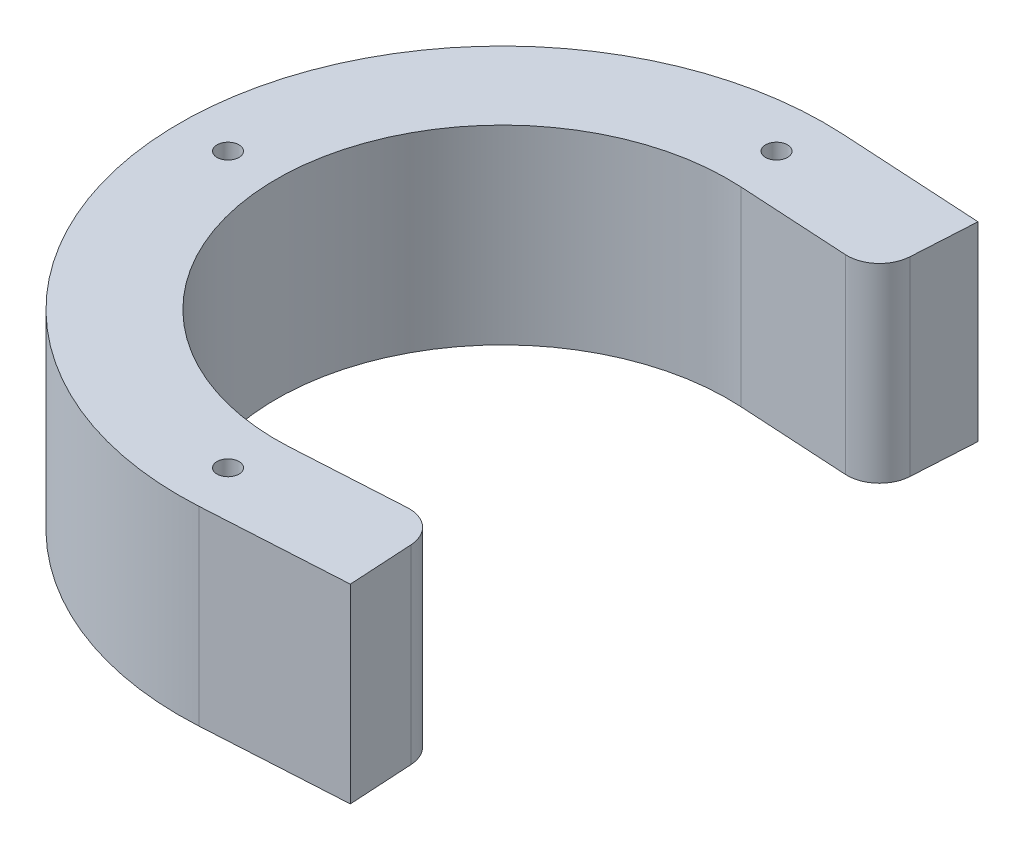
ISO-10303-21;
HEADER;
FILE_DESCRIPTION(('STEP AP214'),'2;1');
FILE_NAME('part.step','',(''),(''),'','','');
FILE_SCHEMA(('AUTOMOTIVE_DESIGN { 1 0 10303 214 1 1 1 1 }'));
ENDSEC;
DATA;
#1=APPLICATION_CONTEXT('core data for automotive mechanical design processes');
#2=APPLICATION_PROTOCOL_DEFINITION('international standard','automotive_design',2000,#1);
#3=PRODUCT_CONTEXT('',#1,'mechanical');
#4=PRODUCT('Part','Part','',(#3));
#5=PRODUCT_RELATED_PRODUCT_CATEGORY('part','',(#4));
#6=PRODUCT_DEFINITION_FORMATION('','',#4);
#7=PRODUCT_DEFINITION_CONTEXT('part definition',#1,'design');
#8=PRODUCT_DEFINITION('design','',#6,#7);
#9=PRODUCT_DEFINITION_SHAPE('','',#8);
#10=(LENGTH_UNIT() NAMED_UNIT(*) SI_UNIT(.MILLI.,.METRE.));
#11=(NAMED_UNIT(*) PLANE_ANGLE_UNIT() SI_UNIT($,.RADIAN.));
#12=(NAMED_UNIT(*) SI_UNIT($,.STERADIAN.) SOLID_ANGLE_UNIT());
#13=UNCERTAINTY_MEASURE_WITH_UNIT(LENGTH_MEASURE(1.E-05),#10,'distance_accuracy_value','');
#14=(GEOMETRIC_REPRESENTATION_CONTEXT(3) GLOBAL_UNCERTAINTY_ASSIGNED_CONTEXT((#13)) GLOBAL_UNIT_ASSIGNED_CONTEXT((#10,
#11,#12)) REPRESENTATION_CONTEXT('',''));
#15=CARTESIAN_POINT('',(0.,0.,0.));
#16=DIRECTION('',(0.,0.,1.));
#17=DIRECTION('',(1.,0.,0.));
#18=AXIS2_PLACEMENT_3D('',#15,#16,#17);
#19=CARTESIAN_POINT('',(0.,29.5,0.));
#20=DIRECTION('',(0.,1.,0.));
#21=DIRECTION('',(0.,0.,1.));
#22=AXIS2_PLACEMENT_3D('',#19,#20,#21);
#23=PLANE('',#22);
#24=CARTESIAN_POINT('',(0.,29.5,-42.5));
#25=DIRECTION('',(0.,1.,0.));
#26=DIRECTION('',(0.,0.,1.));
#27=AXIS2_PLACEMENT_3D('',#24,#25,#26);
#28=CIRCLE('',#27,1.7);
#29=CARTESIAN_POINT('',(0.,29.5,-40.8));
#30=VERTEX_POINT('',#29);
#31=EDGE_CURVE('E221',#30,#30,#28,.T.);
#32=ORIENTED_EDGE('',*,*,#31,.F.);
#33=EDGE_LOOP('',(#32));
#34=FACE_BOUND('',#33,.T.);
#35=DIRECTION('',(-0.0577382695995416,0.,-0.998331754590452));
#36=VECTOR('',#35,1.);
#37=CARTESIAN_POINT('',(24.220839435984,29.5,33.6576799127284));
#38=LINE('',#37,#36);
#39=CARTESIAN_POINT('',(25.0869134799771,29.5,48.6326562315852));
#40=VERTEX_POINT('',#39);
#41=CARTESIAN_POINT('',(24.5095307839817,29.5,38.6493386856806));
#42=VERTEX_POINT('',#41);
#43=EDGE_CURVE('E130',#40,#42,#38,.T.);
#44=ORIENTED_EDGE('',*,*,#43,.T.);
#45=CARTESIAN_POINT('',(19.5178720110294,29.5,38.9380300336784));
#46=DIRECTION('',(0.,1.,0.));
#47=DIRECTION('',(0.,0.,1.));
#48=AXIS2_PLACEMENT_3D('',#45,#46,#47);
#49=CIRCLE('',#48,5.);
#50=CARTESIAN_POINT('',(19.2291806630317,29.5,33.9463712607261));
#51=VERTEX_POINT('',#50);
#52=EDGE_CURVE('E160',#42,#51,#49,.T.);
#53=ORIENTED_EDGE('',*,*,#52,.T.);
#54=DIRECTION('',(-0.998331754590452,0.,0.0577382695995421));
#55=VECTOR('',#54,1.);
#56=CARTESIAN_POINT('',(2.02083943598396,29.5,34.9416114106658));
#57=LINE('',#56,#55);
#58=CARTESIAN_POINT('',(2.02083943598397,29.5,34.9416114106658));
#59=VERTEX_POINT('',#58);
#60=EDGE_CURVE('E215',#51,#59,#57,.T.);
#61=ORIENTED_EDGE('',*,*,#60,.T.);
#62=CARTESIAN_POINT('',(0.,29.5,0.));
#63=DIRECTION('',(0.,-1.,0.));
#64=DIRECTION('',(0.,0.,1.));
#65=AXIS2_PLACEMENT_3D('',#62,#63,#64);
#66=CIRCLE('',#65,35.);
#67=CARTESIAN_POINT('',(2.02083943598396,29.5,-34.9416114106658));
#68=VERTEX_POINT('',#67);
#69=EDGE_CURVE('E197',#59,#68,#66,.T.);
#70=ORIENTED_EDGE('',*,*,#69,.T.);
#71=DIRECTION('',(0.998331754590452,0.,0.0577382695995421));
#72=VECTOR('',#71,1.);
#73=CARTESIAN_POINT('',(2.02083943598396,29.5,-34.9416114106658));
#74=LINE('',#73,#72);
#75=CARTESIAN_POINT('',(19.2291806630317,29.5,-33.9463712607261));
#76=VERTEX_POINT('',#75);
#77=EDGE_CURVE('E212',#68,#76,#74,.T.);
#78=ORIENTED_EDGE('',*,*,#77,.T.);
#79=CARTESIAN_POINT('',(19.5178720110294,29.5,-38.9380300336784));
#80=DIRECTION('',(0.,1.,0.));
#81=DIRECTION('',(0.,0.,1.));
#82=AXIS2_PLACEMENT_3D('',#79,#80,#81);
#83=CIRCLE('',#82,5.);
#84=CARTESIAN_POINT('',(24.5095307839817,29.5,-38.6493386856806));
#85=VERTEX_POINT('',#84);
#86=EDGE_CURVE('E58',#76,#85,#83,.T.);
#87=ORIENTED_EDGE('',*,*,#86,.T.);
#88=DIRECTION('',(0.0577382695995416,0.,-0.998331754590452));
#89=VECTOR('',#88,1.);
#90=CARTESIAN_POINT('',(24.220839435984,29.5,-33.6576799127284));
#91=LINE('',#90,#89);
#92=CARTESIAN_POINT('',(25.0869134799771,29.5,-48.6326562315852));
#93=VERTEX_POINT('',#92);
#94=EDGE_CURVE('E169',#85,#93,#91,.T.);
#95=ORIENTED_EDGE('',*,*,#94,.T.);
#96=DIRECTION('',(-0.998331754590452,0.,-0.0577382695995424));
#97=VECTOR('',#96,1.);
#98=CARTESIAN_POINT('',(2.88691347997709,29.5,-49.9165877295226));
#99=LINE('',#98,#97);
#100=CARTESIAN_POINT('',(2.88691347997709,29.5,-49.9165877295226));
#101=VERTEX_POINT('',#100);
#102=EDGE_CURVE('E136',#93,#101,#99,.T.);
#103=ORIENTED_EDGE('',*,*,#102,.T.);
#104=CARTESIAN_POINT('',(0.,29.5,0.));
#105=DIRECTION('',(0.,1.,0.));
#106=DIRECTION('',(0.,0.,1.));
#107=AXIS2_PLACEMENT_3D('',#104,#105,#106);
#108=CIRCLE('',#107,50.);
#109=CARTESIAN_POINT('',(2.88691347997709,29.5,49.9165877295226));
#110=VERTEX_POINT('',#109);
#111=EDGE_CURVE('E131',#101,#110,#108,.T.);
#112=ORIENTED_EDGE('',*,*,#111,.T.);
#113=DIRECTION('',(0.998331754590452,0.,-0.0577382695995424));
#114=VECTOR('',#113,1.);
#115=CARTESIAN_POINT('',(2.88691347997709,29.5,49.9165877295226));
#116=LINE('',#115,#114);
#117=EDGE_CURVE('E120',#110,#40,#116,.T.);
#118=ORIENTED_EDGE('',*,*,#117,.T.);
#119=EDGE_LOOP('',(#44,#53,#61,#70,#78,#87,#95,#103,#112,#118));
#120=FACE_BOUND('',#119,.T.);
#121=CARTESIAN_POINT('',(-42.5,29.5,0.));
#122=DIRECTION('',(0.,1.,0.));
#123=DIRECTION('',(0.,0.,1.));
#124=AXIS2_PLACEMENT_3D('',#121,#122,#123);
#125=CIRCLE('',#124,1.7);
#126=CARTESIAN_POINT('',(-42.5,29.5,1.7));
#127=VERTEX_POINT('',#126);
#128=EDGE_CURVE('E209',#127,#127,#125,.T.);
#129=ORIENTED_EDGE('',*,*,#128,.F.);
#130=EDGE_LOOP('',(#129));
#131=FACE_BOUND('',#130,.T.);
#132=CARTESIAN_POINT('',(0.,29.5,42.5));
#133=DIRECTION('',(0.,1.,0.));
#134=DIRECTION('',(0.,0.,-1.));
#135=AXIS2_PLACEMENT_3D('',#132,#133,#134);
#136=CIRCLE('',#135,1.7);
#137=CARTESIAN_POINT('',(0.,29.5,40.8));
#138=VERTEX_POINT('',#137);
#139=EDGE_CURVE('E227',#138,#138,#136,.T.);
#140=ORIENTED_EDGE('',*,*,#139,.F.);
#141=EDGE_LOOP('',(#140));
#142=FACE_BOUND('',#141,.T.);
#143=ADVANCED_FACE('F43',(#34,#120,#131,#142),#23,.T.);
#144=CARTESIAN_POINT('',(0.,0.,0.));
#145=DIRECTION('',(0.,1.,0.));
#146=DIRECTION('',(0.,0.,1.));
#147=AXIS2_PLACEMENT_3D('',#144,#145,#146);
#148=PLANE('',#147);
#149=DIRECTION('',(-0.998331754590452,0.,0.0577382695995421));
#150=VECTOR('',#149,1.);
#151=CARTESIAN_POINT('',(2.02083943598396,0.,34.9416114106658));
#152=LINE('',#151,#150);
#153=CARTESIAN_POINT('',(19.2291806630317,0.,33.9463712607261));
#154=VERTEX_POINT('',#153);
#155=CARTESIAN_POINT('',(2.02083943598397,0.,34.9416114106658));
#156=VERTEX_POINT('',#155);
#157=EDGE_CURVE('E200',#154,#156,#152,.T.);
#158=ORIENTED_EDGE('',*,*,#157,.F.);
#159=CARTESIAN_POINT('',(19.5178720110294,0.,38.9380300336784));
#160=DIRECTION('',(0.,1.,0.));
#161=DIRECTION('',(0.,0.,1.));
#162=AXIS2_PLACEMENT_3D('',#159,#160,#161);
#163=CIRCLE('',#162,5.);
#164=CARTESIAN_POINT('',(24.5095307839817,0.,38.6493386856806));
#165=VERTEX_POINT('',#164);
#166=EDGE_CURVE('E155',#154,#165,#163,.F.);
#167=ORIENTED_EDGE('',*,*,#166,.T.);
#168=DIRECTION('',(-0.0577382695995416,0.,-0.998331754590452));
#169=VECTOR('',#168,1.);
#170=CARTESIAN_POINT('',(24.220839435984,0.,33.6576799127284));
#171=LINE('',#170,#169);
#172=CARTESIAN_POINT('',(25.0869134799771,0.,48.6326562315852));
#173=VERTEX_POINT('',#172);
#174=EDGE_CURVE('E201',#173,#165,#171,.T.);
#175=ORIENTED_EDGE('',*,*,#174,.F.);
#176=DIRECTION('',(0.998331754590452,0.,-0.0577382695995424));
#177=VECTOR('',#176,1.);
#178=CARTESIAN_POINT('',(2.88691347997709,0.,49.9165877295226));
#179=LINE('',#178,#177);
#180=CARTESIAN_POINT('',(2.88691347997709,0.,49.9165877295226));
#181=VERTEX_POINT('',#180);
#182=EDGE_CURVE('E206',#181,#173,#179,.T.);
#183=ORIENTED_EDGE('',*,*,#182,.F.);
#184=CARTESIAN_POINT('',(0.,0.,0.));
#185=DIRECTION('',(0.,1.,0.));
#186=DIRECTION('',(0.,0.,1.));
#187=AXIS2_PLACEMENT_3D('',#184,#185,#186);
#188=CIRCLE('',#187,50.);
#189=CARTESIAN_POINT('',(2.88691347997709,0.,-49.9165877295226));
#190=VERTEX_POINT('',#189);
#191=EDGE_CURVE('E144',#190,#181,#188,.T.);
#192=ORIENTED_EDGE('',*,*,#191,.F.);
#193=DIRECTION('',(-0.998331754590452,0.,-0.0577382695995424));
#194=VECTOR('',#193,1.);
#195=CARTESIAN_POINT('',(2.88691347997709,0.,-49.9165877295226));
#196=LINE('',#195,#194);
#197=CARTESIAN_POINT('',(25.0869134799771,0.,-48.6326562315852));
#198=VERTEX_POINT('',#197);
#199=EDGE_CURVE('E140',#198,#190,#196,.T.);
#200=ORIENTED_EDGE('',*,*,#199,.F.);
#201=DIRECTION('',(0.0577382695995416,0.,-0.998331754590452));
#202=VECTOR('',#201,1.);
#203=CARTESIAN_POINT('',(24.220839435984,0.,-33.6576799127284));
#204=LINE('',#203,#202);
#205=CARTESIAN_POINT('',(24.5095307839817,0.,-38.6493386856806));
#206=VERTEX_POINT('',#205);
#207=EDGE_CURVE('E167',#206,#198,#204,.T.);
#208=ORIENTED_EDGE('',*,*,#207,.F.);
#209=CARTESIAN_POINT('',(19.5178720110294,0.,-38.9380300336784));
#210=DIRECTION('',(0.,1.,0.));
#211=DIRECTION('',(0.,0.,1.));
#212=AXIS2_PLACEMENT_3D('',#209,#210,#211);
#213=CIRCLE('',#212,5.);
#214=CARTESIAN_POINT('',(19.2291806630317,0.,-33.9463712607261));
#215=VERTEX_POINT('',#214);
#216=EDGE_CURVE('E148',#206,#215,#213,.F.);
#217=ORIENTED_EDGE('',*,*,#216,.T.);
#218=DIRECTION('',(0.998331754590452,0.,0.0577382695995421));
#219=VECTOR('',#218,1.);
#220=CARTESIAN_POINT('',(2.02083943598396,0.,-34.9416114106658));
#221=LINE('',#220,#219);
#222=CARTESIAN_POINT('',(2.02083943598396,0.,-34.9416114106658));
#223=VERTEX_POINT('',#222);
#224=EDGE_CURVE('E177',#223,#215,#221,.T.);
#225=ORIENTED_EDGE('',*,*,#224,.F.);
#226=CARTESIAN_POINT('',(0.,0.,0.));
#227=DIRECTION('',(0.,-1.,0.));
#228=DIRECTION('',(0.,0.,1.));
#229=AXIS2_PLACEMENT_3D('',#226,#227,#228);
#230=CIRCLE('',#229,35.);
#231=EDGE_CURVE('E180',#156,#223,#230,.T.);
#232=ORIENTED_EDGE('',*,*,#231,.F.);
#233=EDGE_LOOP('',(#158,#167,#175,#183,#192,#200,#208,#217,#225,#232));
#234=FACE_BOUND('',#233,.T.);
#235=CARTESIAN_POINT('',(-42.5,0.,0.));
#236=DIRECTION('',(0.,1.,0.));
#237=DIRECTION('',(0.,0.,1.));
#238=AXIS2_PLACEMENT_3D('',#235,#236,#237);
#239=CIRCLE('',#238,1.7);
#240=CARTESIAN_POINT('',(-42.5,0.,1.7));
#241=VERTEX_POINT('',#240);
#242=EDGE_CURVE('E218',#241,#241,#239,.T.);
#243=ORIENTED_EDGE('',*,*,#242,.T.);
#244=EDGE_LOOP('',(#243));
#245=FACE_BOUND('',#244,.T.);
#246=CARTESIAN_POINT('',(0.,0.,-42.5));
#247=DIRECTION('',(0.,1.,0.));
#248=DIRECTION('',(0.,0.,1.));
#249=AXIS2_PLACEMENT_3D('',#246,#247,#248);
#250=CIRCLE('',#249,1.7);
#251=CARTESIAN_POINT('',(0.,0.,-40.8));
#252=VERTEX_POINT('',#251);
#253=EDGE_CURVE('E224',#252,#252,#250,.T.);
#254=ORIENTED_EDGE('',*,*,#253,.T.);
#255=EDGE_LOOP('',(#254));
#256=FACE_BOUND('',#255,.T.);
#257=CARTESIAN_POINT('',(0.,0.,42.5));
#258=DIRECTION('',(0.,1.,0.));
#259=DIRECTION('',(0.,0.,-1.));
#260=AXIS2_PLACEMENT_3D('',#257,#258,#259);
#261=CIRCLE('',#260,1.7);
#262=CARTESIAN_POINT('',(0.,0.,40.8));
#263=VERTEX_POINT('',#262);
#264=EDGE_CURVE('E230',#263,#263,#261,.T.);
#265=ORIENTED_EDGE('',*,*,#264,.T.);
#266=EDGE_LOOP('',(#265));
#267=FACE_BOUND('',#266,.T.);
#268=ADVANCED_FACE('F174',(#234,#245,#256,#267),#148,.F.);
#269=CARTESIAN_POINT('',(0.,29.5,0.));
#270=DIRECTION('',(0.,-1.,0.));
#271=DIRECTION('',(0.,0.,-1.));
#272=AXIS2_PLACEMENT_3D('',#269,#270,#271);
#273=CYLINDRICAL_SURFACE('',#272,50.);
#274=ORIENTED_EDGE('',*,*,#191,.T.);
#275=DIRECTION('',(0.,-1.,0.));
#276=VECTOR('',#275,1.);
#277=CARTESIAN_POINT('',(2.88691347997709,29.5,49.9165877295226));
#278=LINE('',#277,#276);
#279=EDGE_CURVE('E124',#110,#181,#278,.T.);
#280=ORIENTED_EDGE('',*,*,#279,.F.);
#281=ORIENTED_EDGE('',*,*,#111,.F.);
#282=DIRECTION('',(0.,-1.,0.));
#283=VECTOR('',#282,1.);
#284=CARTESIAN_POINT('',(2.88691347997709,29.5,-49.9165877295226));
#285=LINE('',#284,#283);
#286=EDGE_CURVE('E184',#101,#190,#285,.T.);
#287=ORIENTED_EDGE('',*,*,#286,.T.);
#288=EDGE_LOOP('',(#274,#280,#281,#287));
#289=FACE_BOUND('',#288,.T.);
#290=ADVANCED_FACE('F142',(#289),#273,.T.);
#291=CARTESIAN_POINT('',(2.88691347997709,29.5,49.9165877295226));
#292=DIRECTION('',(-0.0577382695995424,0.,-0.998331754590452));
#293=DIRECTION('',(-0.998331754590452,0.,0.0577382695995424));
#294=AXIS2_PLACEMENT_3D('',#291,#292,#293);
#295=PLANE('',#294);
#296=ORIENTED_EDGE('',*,*,#182,.T.);
#297=DIRECTION('',(0.,-1.,0.));
#298=VECTOR('',#297,1.);
#299=CARTESIAN_POINT('',(25.0869134799771,29.5,48.6326562315852));
#300=LINE('',#299,#298);
#301=EDGE_CURVE('E127',#40,#173,#300,.T.);
#302=ORIENTED_EDGE('',*,*,#301,.F.);
#303=ORIENTED_EDGE('',*,*,#117,.F.);
#304=ORIENTED_EDGE('',*,*,#279,.T.);
#305=EDGE_LOOP('',(#296,#302,#303,#304));
#306=FACE_BOUND('',#305,.T.);
#307=ADVANCED_FACE('F122',(#306),#295,.F.);
#308=CARTESIAN_POINT('',(24.220839435984,29.5,33.6576799127284));
#309=DIRECTION('',(-0.998331754590452,0.,0.0577382695995416));
#310=DIRECTION('',(0.0577382695995416,0.,0.998331754590452));
#311=AXIS2_PLACEMENT_3D('',#308,#309,#310);
#312=PLANE('',#311);
#313=ORIENTED_EDGE('',*,*,#174,.T.);
#314=DIRECTION('',(0.,-1.,0.));
#315=VECTOR('',#314,1.);
#316=CARTESIAN_POINT('',(24.5095307839817,29.5,38.6493386856806));
#317=LINE('',#316,#315);
#318=EDGE_CURVE('E157',#165,#42,#317,.F.);
#319=ORIENTED_EDGE('',*,*,#318,.T.);
#320=ORIENTED_EDGE('',*,*,#43,.F.);
#321=ORIENTED_EDGE('',*,*,#301,.T.);
#322=EDGE_LOOP('',(#313,#319,#320,#321));
#323=FACE_BOUND('',#322,.T.);
#324=ADVANCED_FACE('F266',(#323),#312,.F.);
#325=CARTESIAN_POINT('',(2.02083943598396,29.5,34.9416114106658));
#326=DIRECTION('',(0.0577382695995421,0.,0.998331754590452));
#327=DIRECTION('',(0.998331754590452,0.,-0.0577382695995421));
#328=AXIS2_PLACEMENT_3D('',#325,#326,#327);
#329=PLANE('',#328);
#330=ORIENTED_EDGE('',*,*,#60,.F.);
#331=DIRECTION('',(0.,-1.,0.));
#332=VECTOR('',#331,1.);
#333=CARTESIAN_POINT('',(19.2291806630317,29.5,33.9463712607261));
#334=LINE('',#333,#332);
#335=EDGE_CURVE('E145',#51,#154,#334,.T.);
#336=ORIENTED_EDGE('',*,*,#335,.T.);
#337=ORIENTED_EDGE('',*,*,#157,.T.);
#338=DIRECTION('',(0.,-1.,0.));
#339=VECTOR('',#338,1.);
#340=CARTESIAN_POINT('',(2.02083943598397,29.5,34.9416114106658));
#341=LINE('',#340,#339);
#342=EDGE_CURVE('E150',#59,#156,#341,.T.);
#343=ORIENTED_EDGE('',*,*,#342,.F.);
#344=EDGE_LOOP('',(#330,#336,#337,#343));
#345=FACE_BOUND('',#344,.T.);
#346=ADVANCED_FACE('F263',(#345),#329,.F.);
#347=CARTESIAN_POINT('',(0.,29.5,0.));
#348=DIRECTION('',(0.,-1.,0.));
#349=DIRECTION('',(0.,0.,-1.));
#350=AXIS2_PLACEMENT_3D('',#347,#348,#349);
#351=CYLINDRICAL_SURFACE('',#350,35.);
#352=ORIENTED_EDGE('',*,*,#231,.T.);
#353=DIRECTION('',(0.,-1.,0.));
#354=VECTOR('',#353,1.);
#355=CARTESIAN_POINT('',(2.02083943598396,29.5,-34.9416114106658));
#356=LINE('',#355,#354);
#357=EDGE_CURVE('E188',#68,#223,#356,.T.);
#358=ORIENTED_EDGE('',*,*,#357,.F.);
#359=ORIENTED_EDGE('',*,*,#69,.F.);
#360=ORIENTED_EDGE('',*,*,#342,.T.);
#361=EDGE_LOOP('',(#352,#358,#359,#360));
#362=FACE_BOUND('',#361,.T.);
#363=ADVANCED_FACE('F195',(#362),#351,.F.);
#364=CARTESIAN_POINT('',(2.02083943598396,29.5,-34.9416114106658));
#365=DIRECTION('',(0.0577382695995421,0.,-0.998331754590452));
#366=DIRECTION('',(-0.998331754590452,0.,-0.0577382695995421));
#367=AXIS2_PLACEMENT_3D('',#364,#365,#366);
#368=PLANE('',#367);
#369=ORIENTED_EDGE('',*,*,#224,.T.);
#370=DIRECTION('',(0.,-1.,0.));
#371=VECTOR('',#370,1.);
#372=CARTESIAN_POINT('',(19.2291806630317,29.5,-33.9463712607261));
#373=LINE('',#372,#371);
#374=EDGE_CURVE('E11',#215,#76,#373,.F.);
#375=ORIENTED_EDGE('',*,*,#374,.T.);
#376=ORIENTED_EDGE('',*,*,#77,.F.);
#377=ORIENTED_EDGE('',*,*,#357,.T.);
#378=EDGE_LOOP('',(#369,#375,#376,#377));
#379=FACE_BOUND('',#378,.T.);
#380=ADVANCED_FACE('F258',(#379),#368,.F.);
#381=CARTESIAN_POINT('',(24.220839435984,29.5,-33.6576799127284));
#382=DIRECTION('',(-0.998331754590452,0.,-0.0577382695995416));
#383=DIRECTION('',(-0.0577382695995416,0.,0.998331754590452));
#384=AXIS2_PLACEMENT_3D('',#381,#382,#383);
#385=PLANE('',#384);
#386=ORIENTED_EDGE('',*,*,#94,.F.);
#387=DIRECTION('',(0.,-1.,0.));
#388=VECTOR('',#387,1.);
#389=CARTESIAN_POINT('',(24.5095307839817,29.5,-38.6493386856806));
#390=LINE('',#389,#388);
#391=EDGE_CURVE('E51',#85,#206,#390,.T.);
#392=ORIENTED_EDGE('',*,*,#391,.T.);
#393=ORIENTED_EDGE('',*,*,#207,.T.);
#394=DIRECTION('',(0.,-1.,0.));
#395=VECTOR('',#394,1.);
#396=CARTESIAN_POINT('',(25.0869134799771,29.5,-48.6326562315852));
#397=LINE('',#396,#395);
#398=EDGE_CURVE('E186',#93,#198,#397,.T.);
#399=ORIENTED_EDGE('',*,*,#398,.F.);
#400=EDGE_LOOP('',(#386,#392,#393,#399));
#401=FACE_BOUND('',#400,.T.);
#402=ADVANCED_FACE('F165',(#401),#385,.F.);
#403=CARTESIAN_POINT('',(2.88691347997709,29.5,-49.9165877295226));
#404=DIRECTION('',(-0.0577382695995424,0.,0.998331754590452));
#405=DIRECTION('',(0.998331754590452,0.,0.0577382695995424));
#406=AXIS2_PLACEMENT_3D('',#403,#404,#405);
#407=PLANE('',#406);
#408=ORIENTED_EDGE('',*,*,#199,.T.);
#409=ORIENTED_EDGE('',*,*,#286,.F.);
#410=ORIENTED_EDGE('',*,*,#102,.F.);
#411=ORIENTED_EDGE('',*,*,#398,.T.);
#412=EDGE_LOOP('',(#408,#409,#410,#411));
#413=FACE_BOUND('',#412,.T.);
#414=ADVANCED_FACE('F252',(#413),#407,.F.);
#415=CARTESIAN_POINT('',(-42.5,29.5,0.));
#416=DIRECTION('',(0.,-1.,0.));
#417=DIRECTION('',(0.,0.,-1.));
#418=AXIS2_PLACEMENT_3D('',#415,#416,#417);
#419=CYLINDRICAL_SURFACE('',#418,1.7);
#420=ORIENTED_EDGE('',*,*,#128,.T.);
#421=EDGE_LOOP('',(#420));
#422=FACE_BOUND('',#421,.T.);
#423=ORIENTED_EDGE('',*,*,#242,.F.);
#424=EDGE_LOOP('',(#423));
#425=FACE_BOUND('',#424,.T.);
#426=ADVANCED_FACE('F249',(#422,#425),#419,.F.);
#427=CARTESIAN_POINT('',(0.,29.5,-42.5));
#428=DIRECTION('',(0.,-1.,0.));
#429=DIRECTION('',(0.,0.,-1.));
#430=AXIS2_PLACEMENT_3D('',#427,#428,#429);
#431=CYLINDRICAL_SURFACE('',#430,1.7);
#432=ORIENTED_EDGE('',*,*,#31,.T.);
#433=EDGE_LOOP('',(#432));
#434=FACE_BOUND('',#433,.T.);
#435=ORIENTED_EDGE('',*,*,#253,.F.);
#436=EDGE_LOOP('',(#435));
#437=FACE_BOUND('',#436,.T.);
#438=ADVANCED_FACE('F279',(#434,#437),#431,.F.);
#439=CARTESIAN_POINT('',(0.,29.5,42.5));
#440=DIRECTION('',(0.,-1.,0.));
#441=DIRECTION('',(0.,0.,-1.));
#442=AXIS2_PLACEMENT_3D('',#439,#440,#441);
#443=CYLINDRICAL_SURFACE('',#442,1.7);
#444=ORIENTED_EDGE('',*,*,#139,.T.);
#445=EDGE_LOOP('',(#444));
#446=FACE_BOUND('',#445,.T.);
#447=ORIENTED_EDGE('',*,*,#264,.F.);
#448=EDGE_LOOP('',(#447));
#449=FACE_BOUND('',#448,.T.);
#450=ADVANCED_FACE('F236',(#446,#449),#443,.F.);
#451=CARTESIAN_POINT('',(19.5178720110294,29.5,38.9380300336784));
#452=DIRECTION('',(0.,-1.,0.));
#453=DIRECTION('',(0.,0.,-1.));
#454=AXIS2_PLACEMENT_3D('',#451,#452,#453);
#455=CYLINDRICAL_SURFACE('',#454,5.);
#456=ORIENTED_EDGE('',*,*,#52,.F.);
#457=ORIENTED_EDGE('',*,*,#318,.F.);
#458=ORIENTED_EDGE('',*,*,#166,.F.);
#459=ORIENTED_EDGE('',*,*,#335,.F.);
#460=EDGE_LOOP('',(#456,#457,#458,#459));
#461=FACE_BOUND('',#460,.T.);
#462=ADVANCED_FACE('F273',(#461),#455,.T.);
#463=CARTESIAN_POINT('',(19.5178720110294,29.5,-38.9380300336784));
#464=DIRECTION('',(0.,-1.,0.));
#465=DIRECTION('',(0.,0.,-1.));
#466=AXIS2_PLACEMENT_3D('',#463,#464,#465);
#467=CYLINDRICAL_SURFACE('',#466,5.);
#468=ORIENTED_EDGE('',*,*,#86,.F.);
#469=ORIENTED_EDGE('',*,*,#374,.F.);
#470=ORIENTED_EDGE('',*,*,#216,.F.);
#471=ORIENTED_EDGE('',*,*,#391,.F.);
#472=EDGE_LOOP('',(#468,#469,#470,#471));
#473=FACE_BOUND('',#472,.T.);
#474=ADVANCED_FACE('F45',(#473),#467,.T.);
#475=CLOSED_SHELL('',(#143,#268,#290,#307,#324,#346,#363,#380,#402,#414,#426,#438,#450,#462,#474));
#476=MANIFOLD_SOLID_BREP('B2',#475);
#477=ADVANCED_BREP_SHAPE_REPRESENTATION('',(#18,#476),#14);
#478=SHAPE_DEFINITION_REPRESENTATION(#9,#477);
ENDSEC;
END-ISO-10303-21;
